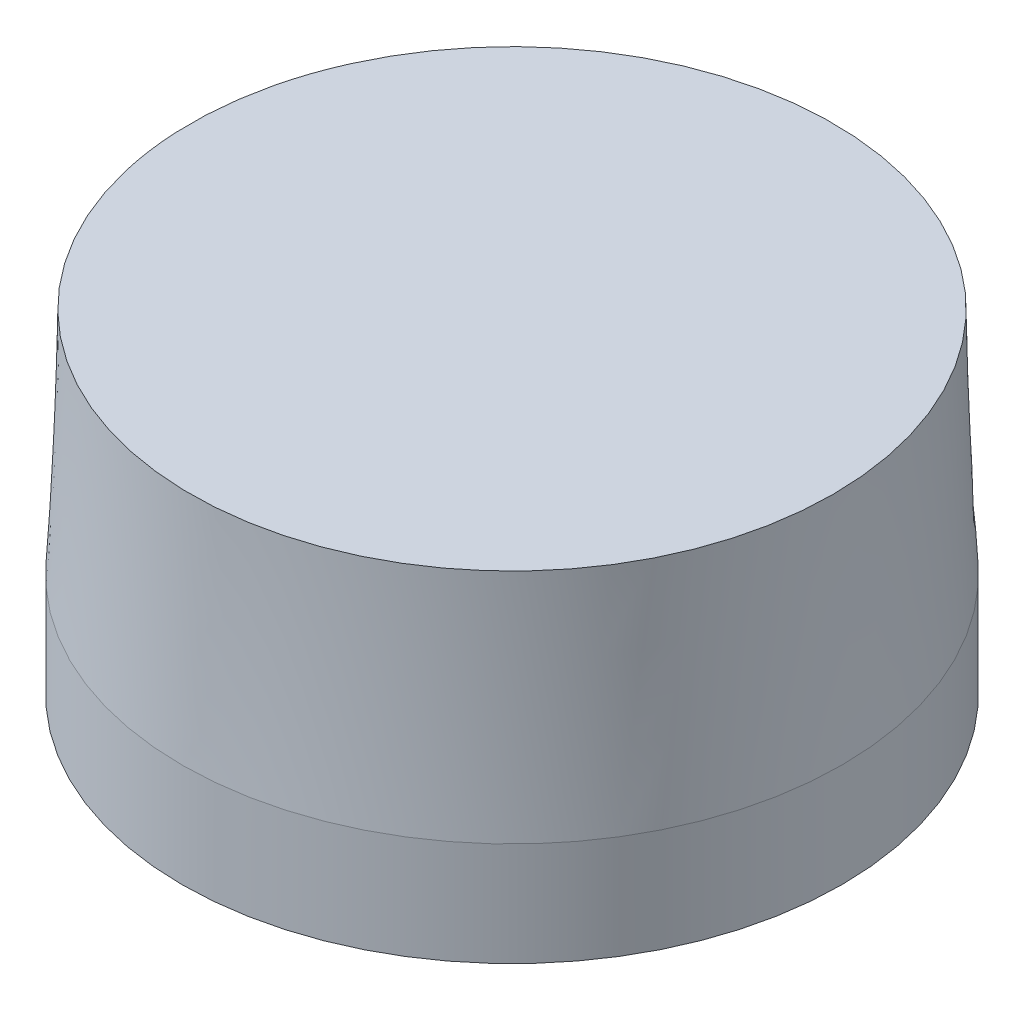
ISO-10303-21;
HEADER;
FILE_DESCRIPTION(('STEP AP214'),'2;1');
FILE_NAME('part.step','',(''),(''),'','','');
FILE_SCHEMA(('AUTOMOTIVE_DESIGN { 1 0 10303 214 1 1 1 1 }'));
ENDSEC;
DATA;
#1=APPLICATION_CONTEXT('core data for automotive mechanical design processes');
#2=APPLICATION_PROTOCOL_DEFINITION('international standard','automotive_design',2000,#1);
#3=PRODUCT_CONTEXT('',#1,'mechanical');
#4=PRODUCT('Part','Part','',(#3));
#5=PRODUCT_RELATED_PRODUCT_CATEGORY('part','',(#4));
#6=PRODUCT_DEFINITION_FORMATION('','',#4);
#7=PRODUCT_DEFINITION_CONTEXT('part definition',#1,'design');
#8=PRODUCT_DEFINITION('design','',#6,#7);
#9=PRODUCT_DEFINITION_SHAPE('','',#8);
#10=(LENGTH_UNIT() NAMED_UNIT(*) SI_UNIT(.MILLI.,.METRE.));
#11=(NAMED_UNIT(*) PLANE_ANGLE_UNIT() SI_UNIT($,.RADIAN.));
#12=(NAMED_UNIT(*) SI_UNIT($,.STERADIAN.) SOLID_ANGLE_UNIT());
#13=UNCERTAINTY_MEASURE_WITH_UNIT(LENGTH_MEASURE(1.E-05),#10,'distance_accuracy_value','');
#14=(GEOMETRIC_REPRESENTATION_CONTEXT(3) GLOBAL_UNCERTAINTY_ASSIGNED_CONTEXT((#13)) GLOBAL_UNIT_ASSIGNED_CONTEXT((#10,
#11,#12)) REPRESENTATION_CONTEXT('',''));
#15=CARTESIAN_POINT('',(0.,0.,0.));
#16=DIRECTION('',(0.,0.,1.));
#17=DIRECTION('',(1.,0.,0.));
#18=AXIS2_PLACEMENT_3D('',#15,#16,#17);
#19=CARTESIAN_POINT('',(19.65,2.25,-9.14157778240864));
#20=DIRECTION('',(0.,0.,1.));
#21=DIRECTION('',(1.,0.,0.));
#22=AXIS2_PLACEMENT_3D('',#19,#20,#21);
#23=PLANE('',#22);
#24=DIRECTION('',(-1.,0.,0.));
#25=VECTOR('',#24,1.);
#26=CARTESIAN_POINT('',(20.9,12.1830742590573,-9.14157778240864));
#27=LINE('',#26,#25);
#28=CARTESIAN_POINT('',(19.65,12.1830742590573,-9.14157778240864));
#29=VERTEX_POINT('',#28);
#30=CARTESIAN_POINT('',(18.9,12.1830742590573,-9.14157778240864));
#31=VERTEX_POINT('',#30);
#32=EDGE_CURVE('E150',#29,#31,#27,.T.);
#33=ORIENTED_EDGE('',*,*,#32,.T.);
#34=DIRECTION('',(0.,1.,0.));
#35=VECTOR('',#34,1.);
#36=CARTESIAN_POINT('',(18.9,2.25,-9.14157778240864));
#37=LINE('',#36,#35);
#38=CARTESIAN_POINT('',(18.9,2.25,-9.14157778240864));
#39=VERTEX_POINT('',#38);
#40=EDGE_CURVE('E183',#39,#31,#37,.T.);
#41=ORIENTED_EDGE('',*,*,#40,.F.);
#42=DIRECTION('',(1.,0.,0.));
#43=VECTOR('',#42,1.);
#44=CARTESIAN_POINT('',(19.65,2.25,-9.14157778240864));
#45=LINE('',#44,#43);
#46=CARTESIAN_POINT('',(19.65,2.25,-9.14157778240864));
#47=VERTEX_POINT('',#46);
#48=EDGE_CURVE('E167',#39,#47,#45,.T.);
#49=ORIENTED_EDGE('',*,*,#48,.T.);
#50=DIRECTION('',(0.,1.,0.));
#51=VECTOR('',#50,1.);
#52=CARTESIAN_POINT('',(19.65,2.25,-9.14157778240864));
#53=LINE('',#52,#51);
#54=EDGE_CURVE('E186',#47,#29,#53,.T.);
#55=ORIENTED_EDGE('',*,*,#54,.T.);
#56=EDGE_LOOP('',(#33,#41,#49,#55));
#57=FACE_BOUND('',#56,.T.);
#58=ADVANCED_FACE('F37',(#57),#23,.T.);
#59=CARTESIAN_POINT('',(0.,25.,0.));
#60=DIRECTION('',(0.,-1.,0.));
#61=DIRECTION('',(0.,0.,-1.));
#62=AXIS2_PLACEMENT_3D('',#59,#60,#61);
#63=CYLINDRICAL_SURFACE('',#62,26.9);
#64=DIRECTION('',(0.,1.,0.));
#65=VECTOR('',#64,1.);
#66=CARTESIAN_POINT('',(19.65,2.25,-18.370832860815));
#67=LINE('',#66,#65);
#68=CARTESIAN_POINT('',(19.65,2.25,-18.370832860815));
#69=VERTEX_POINT('',#68);
#70=CARTESIAN_POINT('',(19.65,24.25,-18.370832860815));
#71=VERTEX_POINT('',#70);
#72=EDGE_CURVE('E60',#69,#71,#67,.T.);
#73=ORIENTED_EDGE('',*,*,#72,.F.);
#74=CARTESIAN_POINT('',(0.,2.25,0.));
#75=DIRECTION('',(0.,1.,0.));
#76=DIRECTION('',(0.,0.,1.));
#77=AXIS2_PLACEMENT_3D('',#74,#75,#76);
#78=CIRCLE('',#77,26.9);
#79=CARTESIAN_POINT('',(18.9,2.25,-19.1415777824086));
#80=VERTEX_POINT('',#79);
#81=EDGE_CURVE('E161',#69,#80,#78,.T.);
#82=ORIENTED_EDGE('',*,*,#81,.T.);
#83=DIRECTION('',(0.,1.,0.));
#84=VECTOR('',#83,1.);
#85=CARTESIAN_POINT('',(18.9,2.25,-19.1415777824086));
#86=LINE('',#85,#84);
#87=CARTESIAN_POINT('',(18.9,24.25,-19.1415777824086));
#88=VERTEX_POINT('',#87);
#89=EDGE_CURVE('E173',#80,#88,#86,.T.);
#90=ORIENTED_EDGE('',*,*,#89,.T.);
#91=CARTESIAN_POINT('',(0.,24.25,0.));
#92=DIRECTION('',(0.,-1.,0.));
#93=DIRECTION('',(0.,0.,-1.));
#94=AXIS2_PLACEMENT_3D('',#91,#92,#93);
#95=CIRCLE('',#94,26.9);
#96=CARTESIAN_POINT('',(18.9,24.25,19.1415777824086));
#97=VERTEX_POINT('',#96);
#98=EDGE_CURVE('E218',#97,#88,#95,.T.);
#99=ORIENTED_EDGE('',*,*,#98,.F.);
#100=DIRECTION('',(0.,1.,0.));
#101=VECTOR('',#100,1.);
#102=CARTESIAN_POINT('',(18.9,2.25,19.1415777824086));
#103=LINE('',#102,#101);
#104=CARTESIAN_POINT('',(18.9,2.25,19.1415777824086));
#105=VERTEX_POINT('',#104);
#106=EDGE_CURVE('E215',#105,#97,#103,.T.);
#107=ORIENTED_EDGE('',*,*,#106,.F.);
#108=CARTESIAN_POINT('',(0.,2.25,0.));
#109=DIRECTION('',(0.,-1.,0.));
#110=DIRECTION('',(0.,0.,-1.));
#111=AXIS2_PLACEMENT_3D('',#108,#109,#110);
#112=CIRCLE('',#111,26.9);
#113=CARTESIAN_POINT('',(19.65,2.25,18.370832860815));
#114=VERTEX_POINT('',#113);
#115=EDGE_CURVE('E191',#114,#105,#112,.T.);
#116=ORIENTED_EDGE('',*,*,#115,.F.);
#117=DIRECTION('',(0.,1.,0.));
#118=VECTOR('',#117,1.);
#119=CARTESIAN_POINT('',(19.65,2.25,18.370832860815));
#120=LINE('',#119,#118);
#121=CARTESIAN_POINT('',(19.65,24.25,18.370832860815));
#122=VERTEX_POINT('',#121);
#123=EDGE_CURVE('E201',#114,#122,#120,.T.);
#124=ORIENTED_EDGE('',*,*,#123,.T.);
#125=EDGE_CURVE('E217',#71,#122,#95,.T.);
#126=ORIENTED_EDGE('',*,*,#125,.F.);
#127=EDGE_LOOP('',(#73,#82,#90,#99,#107,#116,#124,#126));
#128=FACE_BOUND('',#127,.T.);
#129=CARTESIAN_POINT('',(0.,0.,0.));
#130=DIRECTION('',(0.,1.,0.));
#131=DIRECTION('',(0.,0.,1.));
#132=AXIS2_PLACEMENT_3D('',#129,#130,#131);
#133=CIRCLE('',#132,26.9);
#134=CARTESIAN_POINT('',(0.,0.,26.9));
#135=VERTEX_POINT('',#134);
#136=EDGE_CURVE('E45',#135,#135,#133,.T.);
#137=ORIENTED_EDGE('',*,*,#136,.F.);
#138=EDGE_LOOP('',(#137));
#139=FACE_BOUND('',#138,.T.);
#140=ADVANCED_FACE('F39',(#128,#139),#63,.F.);
#141=CARTESIAN_POINT('',(0.,24.25,0.));
#142=DIRECTION('',(0.,-1.,0.));
#143=DIRECTION('',(0.,0.,-1.));
#144=AXIS2_PLACEMENT_3D('',#141,#142,#143);
#145=PLANE('',#144);
#146=DIRECTION('',(0.,0.,-1.));
#147=VECTOR('',#146,1.);
#148=CARTESIAN_POINT('',(19.65,24.25,-18.370832860815));
#149=LINE('',#148,#147);
#150=CARTESIAN_POINT('',(19.65,24.25,-9.14157778240864));
#151=VERTEX_POINT('',#150);
#152=EDGE_CURVE('E160',#151,#71,#149,.T.);
#153=ORIENTED_EDGE('',*,*,#152,.T.);
#154=ORIENTED_EDGE('',*,*,#125,.T.);
#155=DIRECTION('',(0.,0.,1.));
#156=VECTOR('',#155,1.);
#157=CARTESIAN_POINT('',(19.65,24.25,18.370832860815));
#158=LINE('',#157,#156);
#159=CARTESIAN_POINT('',(19.65,24.25,9.14157778240864));
#160=VERTEX_POINT('',#159);
#161=EDGE_CURVE('E195',#160,#122,#158,.T.);
#162=ORIENTED_EDGE('',*,*,#161,.F.);
#163=DIRECTION('',(1.,0.,0.));
#164=VECTOR('',#163,1.);
#165=CARTESIAN_POINT('',(19.65,24.25,9.14157778240864));
#166=LINE('',#165,#164);
#167=CARTESIAN_POINT('',(18.9,24.25,9.14157778240864));
#168=VERTEX_POINT('',#167);
#169=EDGE_CURVE('E203',#168,#160,#166,.T.);
#170=ORIENTED_EDGE('',*,*,#169,.F.);
#171=DIRECTION('',(0.,0.,-1.));
#172=VECTOR('',#171,1.);
#173=CARTESIAN_POINT('',(18.9,24.25,9.14157778240864));
#174=LINE('',#173,#172);
#175=EDGE_CURVE('E190',#97,#168,#174,.T.);
#176=ORIENTED_EDGE('',*,*,#175,.F.);
#177=ORIENTED_EDGE('',*,*,#98,.T.);
#178=DIRECTION('',(0.,0.,1.));
#179=VECTOR('',#178,1.);
#180=CARTESIAN_POINT('',(18.9,24.25,-9.14157778240864));
#181=LINE('',#180,#179);
#182=CARTESIAN_POINT('',(18.9,24.25,-9.14157778240864));
#183=VERTEX_POINT('',#182);
#184=EDGE_CURVE('E164',#88,#183,#181,.T.);
#185=ORIENTED_EDGE('',*,*,#184,.T.);
#186=DIRECTION('',(1.,0.,0.));
#187=VECTOR('',#186,1.);
#188=CARTESIAN_POINT('',(19.65,24.25,-9.14157778240864));
#189=LINE('',#188,#187);
#190=EDGE_CURVE('E175',#183,#151,#189,.T.);
#191=ORIENTED_EDGE('',*,*,#190,.T.);
#192=EDGE_LOOP('',(#153,#154,#162,#170,#176,#177,#185,#191));
#193=FACE_BOUND('',#192,.T.);
#194=ADVANCED_FACE('F238',(#193),#145,.T.);
#195=CARTESIAN_POINT('',(0.,0.,0.));
#196=DIRECTION('',(0.,1.,0.));
#197=DIRECTION('',(0.,0.,1.));
#198=AXIS2_PLACEMENT_3D('',#195,#196,#197);
#199=PLANE('',#198);
#200=ORIENTED_EDGE('',*,*,#136,.T.);
#201=EDGE_LOOP('',(#200));
#202=FACE_BOUND('',#201,.T.);
#203=CARTESIAN_POINT('',(0.,0.,0.));
#204=DIRECTION('',(0.,1.,0.));
#205=DIRECTION('',(0.,0.,1.));
#206=AXIS2_PLACEMENT_3D('',#203,#204,#205);
#207=CIRCLE('',#206,27.9);
#208=CARTESIAN_POINT('',(0.,0.,27.9));
#209=VERTEX_POINT('',#208);
#210=EDGE_CURVE('E12',#209,#209,#207,.T.);
#211=ORIENTED_EDGE('',*,*,#210,.F.);
#212=EDGE_LOOP('',(#211));
#213=FACE_BOUND('',#212,.T.);
#214=ADVANCED_FACE('F234',(#202,#213),#199,.F.);
#215=CARTESIAN_POINT('',(0.,5.,0.));
#216=DIRECTION('',(0.,-1.,0.));
#217=DIRECTION('',(0.,0.,-1.));
#218=AXIS2_PLACEMENT_3D('',#215,#216,#217);
#219=CYLINDRICAL_SURFACE('',#218,28.65);
#220=CARTESIAN_POINT('',(0.,5.,0.));
#221=DIRECTION('',(0.,1.,0.));
#222=DIRECTION('',(0.,0.,1.));
#223=AXIS2_PLACEMENT_3D('',#220,#221,#222);
#224=CIRCLE('',#223,28.65);
#225=CARTESIAN_POINT('',(27.571898019697,5.,7.78543123991395));
#226=VERTEX_POINT('',#225);
#227=EDGE_CURVE('E229',#226,#226,#224,.T.);
#228=ORIENTED_EDGE('',*,*,#227,.F.);
#229=EDGE_LOOP('',(#228));
#230=FACE_BOUND('',#229,.T.);
#231=CARTESIAN_POINT('',(0.,-4.,0.));
#232=DIRECTION('',(0.,1.,0.));
#233=DIRECTION('',(0.,0.,1.));
#234=AXIS2_PLACEMENT_3D('',#231,#232,#233);
#235=CIRCLE('',#234,28.65);
#236=CARTESIAN_POINT('',(0.,-4.,28.65));
#237=VERTEX_POINT('',#236);
#238=EDGE_CURVE('E226',#237,#237,#235,.T.);
#239=ORIENTED_EDGE('',*,*,#238,.T.);
#240=EDGE_LOOP('',(#239));
#241=FACE_BOUND('',#240,.T.);
#242=ADVANCED_FACE('F425',(#230,#241),#219,.T.);
#243=CARTESIAN_POINT('',(0.,-4.,0.));
#244=DIRECTION('',(0.,1.,0.));
#245=DIRECTION('',(0.,0.,1.));
#246=AXIS2_PLACEMENT_3D('',#243,#244,#245);
#247=CYLINDRICAL_SURFACE('',#246,27.9);
#248=CARTESIAN_POINT('',(0.,-4.,0.));
#249=DIRECTION('',(0.,1.,0.));
#250=DIRECTION('',(0.,0.,1.));
#251=AXIS2_PLACEMENT_3D('',#248,#249,#250);
#252=CIRCLE('',#251,27.9);
#253=CARTESIAN_POINT('',(0.,-4.,27.9));
#254=VERTEX_POINT('',#253);
#255=EDGE_CURVE('E223',#254,#254,#252,.T.);
#256=ORIENTED_EDGE('',*,*,#255,.F.);
#257=EDGE_LOOP('',(#256));
#258=FACE_BOUND('',#257,.T.);
#259=ORIENTED_EDGE('',*,*,#210,.T.);
#260=EDGE_LOOP('',(#259));
#261=FACE_BOUND('',#260,.T.);
#262=ADVANCED_FACE('F414',(#258,#261),#247,.F.);
#263=CARTESIAN_POINT('',(0.,-4.,0.));
#264=DIRECTION('',(0.,1.,0.));
#265=DIRECTION('',(0.,0.,1.));
#266=AXIS2_PLACEMENT_3D('',#263,#264,#265);
#267=PLANE('',#266);
#268=ORIENTED_EDGE('',*,*,#255,.T.);
#269=EDGE_LOOP('',(#268));
#270=FACE_BOUND('',#269,.T.);
#271=ORIENTED_EDGE('',*,*,#238,.F.);
#272=EDGE_LOOP('',(#271));
#273=FACE_BOUND('',#272,.T.);
#274=ADVANCED_FACE('F403',(#270,#273),#267,.F.);
#275=CARTESIAN_POINT('',(27.7794563342098,25.,2.59071530194459));
#276=CARTESIAN_POINT('',(27.571898019697,5.,7.78543123991395));
#277=CARTESIAN_POINT('',(22.5980257303206,25.,58.1496279703642));
#278=CARTESIAN_POINT('',(12.0010355398691,5.,62.929227279308));
#279=CARTESIAN_POINT('',(-32.960886938099,25.,52.968197366475));
#280=CARTESIAN_POINT('',(-43.1427604995249,5.,47.3583647994801));
#281=CARTESIAN_POINT('',(-27.7794563342098,25.,-2.59071530194459));
#282=CARTESIAN_POINT('',(-27.571898019697,5.,-7.78543123991395));
#283=CARTESIAN_POINT('',(-22.5980257303206,25.,-58.1496279703642));
#284=CARTESIAN_POINT('',(-12.0010355398691,5.,-62.9292272793079));
#285=CARTESIAN_POINT('',(32.960886938099,25.,-52.9681973664751));
#286=CARTESIAN_POINT('',(43.1427604995249,5.,-47.35836479948));
#287=CARTESIAN_POINT('',(27.7794563342098,25.,2.59071530194459));
#288=CARTESIAN_POINT('',(27.571898019697,5.,7.78543123991395));
#289=(BOUNDED_SURFACE() B_SPLINE_SURFACE(3,1,((#275,#276),(#277,#278),(#279,#280),(#281,#282),
(#283,#284),(#285,#286),(#287,#288)),.UNSPECIFIED.,.T.,.F.,.F.) B_SPLINE_SURFACE_WITH_KNOTS((4,
3,4),(2,2),(0.,0.5,1.),(0.,1.),
.UNSPECIFIED.) GEOMETRIC_REPRESENTATION_ITEM() RATIONAL_B_SPLINE_SURFACE(((1.,1.),
(0.333333333333333,0.333333333333333),(0.333333333333333,0.333333333333333),(1.,1.),
(0.333333333333333,0.333333333333334),(0.333333333333333,0.333333333333334),(1.,1.))) REPRESENTATION_ITEM('') SURFACE());
#290=CARTESIAN_POINT('',(0.,25.,0.));
#291=DIRECTION('',(0.,1.,0.));
#292=DIRECTION('',(0.,0.,1.));
#293=AXIS2_PLACEMENT_3D('',#290,#291,#292);
#294=CIRCLE('',#293,27.9);
#295=CARTESIAN_POINT('',(27.7794563342098,25.,2.59071530194459));
#296=VERTEX_POINT('',#295);
#297=EDGE_CURVE('E220',#296,#296,#294,.T.);
#298=CARTESIAN_POINT('',(27.7794563342098,25.,2.59071530194459));
#299=CARTESIAN_POINT('',(27.7772942684336,24.7916666666667,2.64482692629843));
#300=CARTESIAN_POINT('',(27.7751322026575,24.5833333333333,2.69893855065228));
#301=CARTESIAN_POINT('',(27.7708080711051,24.1666666666667,2.80716179935998));
#302=CARTESIAN_POINT('',(27.7686460053289,23.9583333333333,2.86127342371382));
#303=CARTESIAN_POINT('',(27.7643218737766,23.5416666666667,2.96949667242152));
#304=CARTESIAN_POINT('',(27.7621598080004,23.3333333333333,3.02360829677537));
#305=CARTESIAN_POINT('',(27.7578356764481,22.9166666666667,3.13183154548306));
#306=CARTESIAN_POINT('',(27.7556736106719,22.7083333333333,3.18594316983691));
#307=CARTESIAN_POINT('',(27.7513494791195,22.2916666666667,3.2941664185446));
#308=CARTESIAN_POINT('',(27.7491874133434,22.0833333333333,3.34827804289845));
#309=CARTESIAN_POINT('',(27.744863281791,21.6666666666667,3.45650129160615));
#310=CARTESIAN_POINT('',(27.7427012160148,21.4583333333333,3.51061291595999));
#311=CARTESIAN_POINT('',(27.7383770844625,21.0416666666667,3.61883616466769));
#312=CARTESIAN_POINT('',(27.7362150186863,20.8333333333333,3.67294778902154));
#313=CARTESIAN_POINT('',(27.731890887134,20.4166666666667,3.78117103772923));
#314=CARTESIAN_POINT('',(27.7297288213578,20.2083333333333,3.83528266208308));
#315=CARTESIAN_POINT('',(27.7254046898054,19.7916666666667,3.94350591079078));
#316=CARTESIAN_POINT('',(27.7232426240293,19.5833333333333,3.99761753514462));
#317=CARTESIAN_POINT('',(27.7189184924769,19.1666666666667,4.10584078385232));
#318=CARTESIAN_POINT('',(27.7167564267007,18.9583333333333,4.15995240820616));
#319=CARTESIAN_POINT('',(27.7124322951484,18.5416666666667,4.26817565691386));
#320=CARTESIAN_POINT('',(27.7102702293722,18.3333333333333,4.32228728126771));
#321=CARTESIAN_POINT('',(27.7059460978199,17.9166666666667,4.4305105299754));
#322=CARTESIAN_POINT('',(27.7037840320437,17.7083333333333,4.48462215432925));
#323=CARTESIAN_POINT('',(27.6994599004913,17.2916666666667,4.59284540303694));
#324=CARTESIAN_POINT('',(27.6972978347152,17.0833333333333,4.64695702739079));
#325=CARTESIAN_POINT('',(27.6929737031628,16.6666666666667,4.75518027609849));
#326=CARTESIAN_POINT('',(27.6908116373866,16.4583333333333,4.80929190045234));
#327=CARTESIAN_POINT('',(27.6864875058343,16.0416666666667,4.91751514916003));
#328=CARTESIAN_POINT('',(27.6843254400581,15.8333333333333,4.97162677351388));
#329=CARTESIAN_POINT('',(27.6800013085058,15.4166666666667,5.07985002222157));
#330=CARTESIAN_POINT('',(27.6778392427296,15.2083333333333,5.13396164657542));
#331=CARTESIAN_POINT('',(27.6735151111772,14.7916666666667,5.24218489528312));
#332=CARTESIAN_POINT('',(27.6713530454011,14.5833333333333,5.29629651963696));
#333=CARTESIAN_POINT('',(27.6670289138487,14.1666666666667,5.40451976834466));
#334=CARTESIAN_POINT('',(27.6648668480725,13.9583333333333,5.45863139269851));
#335=CARTESIAN_POINT('',(27.6605427165202,13.5416666666667,5.5668546414062));
#336=CARTESIAN_POINT('',(27.658380650744,13.3333333333333,5.62096626576005));
#337=CARTESIAN_POINT('',(27.6540565191917,12.9166666666667,5.72918951446774));
#338=CARTESIAN_POINT('',(27.6518944534155,12.7083333333333,5.78330113882159));
#339=CARTESIAN_POINT('',(27.6475703218631,12.2916666666667,5.89152438752929));
#340=CARTESIAN_POINT('',(27.645408256087,12.0833333333333,5.94563601188313));
#341=CARTESIAN_POINT('',(27.6410841245346,11.6666666666667,6.05385926059083));
#342=CARTESIAN_POINT('',(27.6389220587584,11.4583333333333,6.10797088494468));
#343=CARTESIAN_POINT('',(27.6345979272061,11.0416666666667,6.21619413365237));
#344=CARTESIAN_POINT('',(27.6324358614299,10.8333333333333,6.27030575800622));
#345=CARTESIAN_POINT('',(27.6281117298776,10.4166666666667,6.37852900671392));
#346=CARTESIAN_POINT('',(27.6259496641014,10.2083333333333,6.43264063106776));
#347=CARTESIAN_POINT('',(27.621625532549,9.79166666666667,6.54086387977546));
#348=CARTESIAN_POINT('',(27.6194634667729,9.58333333333333,6.5949755041293));
#349=CARTESIAN_POINT('',(27.6151393352205,9.16666666666667,6.703198752837));
#350=CARTESIAN_POINT('',(27.6129772694443,8.95833333333333,6.75731037719085));
#351=CARTESIAN_POINT('',(27.608653137892,8.54166666666667,6.86553362589854));
#352=CARTESIAN_POINT('',(27.6064910721158,8.33333333333333,6.91964525025239));
#353=CARTESIAN_POINT('',(27.6021669405635,7.91666666666667,7.02786849896008));
#354=CARTESIAN_POINT('',(27.6000048747873,7.70833333333333,7.08198012331393));
#355=CARTESIAN_POINT('',(27.5956807432349,7.29166666666667,7.19020337202163));
#356=CARTESIAN_POINT('',(27.5935186774588,7.08333333333333,7.24431499637547));
#357=CARTESIAN_POINT('',(27.5891945459064,6.66666666666667,7.35253824508317));
#358=CARTESIAN_POINT('',(27.5870324801302,6.45833333333333,7.40664986943702));
#359=CARTESIAN_POINT('',(27.5827083485779,6.04166666666667,7.51487311814471));
#360=CARTESIAN_POINT('',(27.5805462828017,5.83333333333333,7.56898474249856));
#361=CARTESIAN_POINT('',(27.5762221512494,5.41666666666667,7.67720799120625));
#362=CARTESIAN_POINT('',(27.5740600854732,5.20833333333333,7.7313196155601));
#363=CARTESIAN_POINT('',(27.571898019697,5.,7.78543123991395));
#364=B_SPLINE_CURVE_WITH_KNOTS('',3,(#298,#299,#300,#301,#302,#303,#304,#305,#306,#307,#308,
#309,#310,#311,#312,#313,#314,#315,#316,#317,#318,#319,#320,#321,#322,#323,#324,#325,#326,#327,
#328,#329,#330,#331,#332,#333,#334,#335,#336,#337,#338,#339,#340,#341,#342,#343,#344,#345,#346,
#347,#348,#349,#350,#351,#352,#353,#354,#355,#356,#357,#358,#359,#360,#361,#362,#363),
.UNSPECIFIED.,.F.,.F.,(4,2,2,2,2,2,2,2,2,2,2,2,2,2,2,2,2,2,2,2,2,2,2,2,2,2,2,2,2,2,2,2,4),(0.,
0.645770610795887,1.29154122159177,1.93731183238766,2.58308244318354,3.22885305397943,
3.87462366477532,4.5203942755712,5.16616488636709,5.81193549716297,6.45770610795886,
7.10347671875475,7.74924732955063,8.39501794034652,9.04078855114241,9.68655916193829,
10.3323297727342,10.9781003835301,11.6238709943259,12.2696416051218,12.9154122159177,
13.5611828267136,14.2069534375095,14.8527240483054,15.4984946591013,16.1442652698972,
16.790035880693,17.4358064914889,18.0815771022848,18.7273477130807,19.3731183238766,
20.0188889346725,20.6646595454684),.UNSPECIFIED.);
#365=EDGE_CURVE('BSEAM392',#296,#226,#364,.T.);
#366=ORIENTED_EDGE('',*,*,#297,.F.);
#367=ORIENTED_EDGE('',*,*,#227,.T.);
#368=ORIENTED_EDGE('',*,*,#365,.T.);
#369=ORIENTED_EDGE('',*,*,#365,.F.);
#370=EDGE_LOOP('',(#366,#368,#367,#369));
#371=FACE_BOUND('',#370,.T.);
#372=ADVANCED_FACE('F392',(#371),#289,.T.);
#373=CARTESIAN_POINT('',(0.,25.,0.));
#374=DIRECTION('',(0.,1.,0.));
#375=DIRECTION('',(0.,0.,1.));
#376=AXIS2_PLACEMENT_3D('',#373,#374,#375);
#377=PLANE('',#376);
#378=ORIENTED_EDGE('',*,*,#297,.T.);
#379=EDGE_LOOP('',(#378));
#380=FACE_BOUND('',#379,.T.);
#381=ADVANCED_FACE('F384',(#380),#377,.T.);
#382=CARTESIAN_POINT('',(18.9,2.25,9.14157778240864));
#383=DIRECTION('',(1.,0.,0.));
#384=DIRECTION('',(0.,0.,-1.));
#385=AXIS2_PLACEMENT_3D('',#382,#383,#384);
#386=PLANE('',#385);
#387=ORIENTED_EDGE('',*,*,#175,.T.);
#388=DIRECTION('',(0.,1.,0.));
#389=VECTOR('',#388,1.);
#390=CARTESIAN_POINT('',(18.9,2.25,9.14157778240864));
#391=LINE('',#390,#389);
#392=CARTESIAN_POINT('',(18.9,2.25,9.14157778240864));
#393=VERTEX_POINT('',#392);
#394=EDGE_CURVE('E212',#393,#168,#391,.T.);
#395=ORIENTED_EDGE('',*,*,#394,.F.);
#396=DIRECTION('',(0.,0.,-1.));
#397=VECTOR('',#396,1.);
#398=CARTESIAN_POINT('',(18.9,2.25,9.14157778240864));
#399=LINE('',#398,#397);
#400=EDGE_CURVE('E194',#105,#393,#399,.T.);
#401=ORIENTED_EDGE('',*,*,#400,.F.);
#402=ORIENTED_EDGE('',*,*,#106,.T.);
#403=EDGE_LOOP('',(#387,#395,#401,#402));
#404=FACE_BOUND('',#403,.T.);
#405=ADVANCED_FACE('F282',(#404),#386,.F.);
#406=CARTESIAN_POINT('',(19.65,2.25,9.14157778240864));
#407=DIRECTION('',(0.,0.,1.));
#408=DIRECTION('',(1.,0.,0.));
#409=AXIS2_PLACEMENT_3D('',#406,#407,#408);
#410=PLANE('',#409);
#411=ORIENTED_EDGE('',*,*,#169,.T.);
#412=DIRECTION('',(0.,1.,0.));
#413=VECTOR('',#412,1.);
#414=CARTESIAN_POINT('',(19.65,2.25,9.14157778240864));
#415=LINE('',#414,#413);
#416=CARTESIAN_POINT('',(19.65,2.25,9.14157778240864));
#417=VERTEX_POINT('',#416);
#418=EDGE_CURVE('E210',#417,#160,#415,.T.);
#419=ORIENTED_EDGE('',*,*,#418,.F.);
#420=DIRECTION('',(1.,0.,0.));
#421=VECTOR('',#420,1.);
#422=CARTESIAN_POINT('',(19.65,2.25,9.14157778240864));
#423=LINE('',#422,#421);
#424=EDGE_CURVE('E197',#393,#417,#423,.T.);
#425=ORIENTED_EDGE('',*,*,#424,.F.);
#426=ORIENTED_EDGE('',*,*,#394,.T.);
#427=EDGE_LOOP('',(#411,#419,#425,#426));
#428=FACE_BOUND('',#427,.T.);
#429=ADVANCED_FACE('F278',(#428),#410,.F.);
#430=CARTESIAN_POINT('',(19.65,2.25,18.370832860815));
#431=DIRECTION('',(-1.,0.,0.));
#432=DIRECTION('',(0.,0.,1.));
#433=AXIS2_PLACEMENT_3D('',#430,#431,#432);
#434=PLANE('',#433);
#435=ORIENTED_EDGE('',*,*,#161,.T.);
#436=ORIENTED_EDGE('',*,*,#123,.F.);
#437=DIRECTION('',(0.,0.,1.));
#438=VECTOR('',#437,1.);
#439=CARTESIAN_POINT('',(19.65,2.25,18.370832860815));
#440=LINE('',#439,#438);
#441=EDGE_CURVE('E199',#417,#114,#440,.T.);
#442=ORIENTED_EDGE('',*,*,#441,.F.);
#443=ORIENTED_EDGE('',*,*,#418,.T.);
#444=EDGE_LOOP('',(#435,#436,#442,#443));
#445=FACE_BOUND('',#444,.T.);
#446=ADVANCED_FACE('F272',(#445),#434,.F.);
#447=CARTESIAN_POINT('',(0.,2.25,0.));
#448=DIRECTION('',(0.,-1.,0.));
#449=DIRECTION('',(0.,0.,-1.));
#450=AXIS2_PLACEMENT_3D('',#447,#448,#449);
#451=PLANE('',#450);
#452=ORIENTED_EDGE('',*,*,#115,.T.);
#453=ORIENTED_EDGE('',*,*,#400,.T.);
#454=ORIENTED_EDGE('',*,*,#424,.T.);
#455=ORIENTED_EDGE('',*,*,#441,.T.);
#456=EDGE_LOOP('',(#452,#453,#454,#455));
#457=FACE_BOUND('',#456,.T.);
#458=ADVANCED_FACE('F260',(#457),#451,.T.);
#459=CARTESIAN_POINT('',(19.65,2.25,-18.370832860815));
#460=DIRECTION('',(1.,0.,0.));
#461=DIRECTION('',(0.,0.,-1.));
#462=AXIS2_PLACEMENT_3D('',#459,#460,#461);
#463=PLANE('',#462);
#464=DIRECTION('',(0.,0.,-1.));
#465=VECTOR('',#464,1.);
#466=CARTESIAN_POINT('',(19.65,12.1830742590573,-18.370832860815));
#467=LINE('',#466,#465);
#468=CARTESIAN_POINT('',(19.65,12.1830742590573,-11.6415777824086));
#469=VERTEX_POINT('',#468);
#470=EDGE_CURVE('E158',#29,#469,#467,.T.);
#471=ORIENTED_EDGE('',*,*,#470,.F.);
#472=ORIENTED_EDGE('',*,*,#54,.F.);
#473=DIRECTION('',(0.,0.,-1.));
#474=VECTOR('',#473,1.);
#475=CARTESIAN_POINT('',(19.65,2.25,-18.370832860815));
#476=LINE('',#475,#474);
#477=EDGE_CURVE('E163',#47,#69,#476,.T.);
#478=ORIENTED_EDGE('',*,*,#477,.T.);
#479=ORIENTED_EDGE('',*,*,#72,.T.);
#480=ORIENTED_EDGE('',*,*,#152,.F.);
#481=CARTESIAN_POINT('',(19.65,15.6830742590573,-9.14157778240864));
#482=VERTEX_POINT('',#481);
#483=EDGE_CURVE('E185',#482,#151,#53,.T.);
#484=ORIENTED_EDGE('',*,*,#483,.F.);
#485=DIRECTION('',(0.,0.,1.));
#486=VECTOR('',#485,1.);
#487=CARTESIAN_POINT('',(19.65,15.6830742590573,-18.370832860815));
#488=LINE('',#487,#486);
#489=CARTESIAN_POINT('',(19.65,15.6830742590573,-11.6415777824086));
#490=VERTEX_POINT('',#489);
#491=EDGE_CURVE('E153',#490,#482,#488,.T.);
#492=ORIENTED_EDGE('',*,*,#491,.F.);
#493=CARTESIAN_POINT('',(19.65,13.9330742590573,-11.6415777824086));
#494=DIRECTION('',(1.,0.,0.));
#495=DIRECTION('',(0.,0.,-1.));
#496=AXIS2_PLACEMENT_3D('',#493,#494,#495);
#497=CIRCLE('',#496,1.75);
#498=EDGE_CURVE('E135',#469,#490,#497,.T.);
#499=ORIENTED_EDGE('',*,*,#498,.F.);
#500=EDGE_LOOP('',(#471,#472,#478,#479,#480,#484,#492,#499));
#501=FACE_BOUND('',#500,.T.);
#502=ADVANCED_FACE('F253',(#501),#463,.T.);
#503=DIRECTION('',(-1.,0.,0.));
#504=VECTOR('',#503,1.);
#505=CARTESIAN_POINT('',(20.9,15.6830742590573,-9.14157778240864));
#506=LINE('',#505,#504);
#507=CARTESIAN_POINT('',(18.9,15.6830742590573,-9.14157778240864));
#508=VERTEX_POINT('',#507);
#509=EDGE_CURVE('E52',#482,#508,#506,.T.);
#510=ORIENTED_EDGE('',*,*,#509,.F.);
#511=ORIENTED_EDGE('',*,*,#483,.T.);
#512=ORIENTED_EDGE('',*,*,#190,.F.);
#513=EDGE_CURVE('E182',#508,#183,#37,.T.);
#514=ORIENTED_EDGE('',*,*,#513,.F.);
#515=EDGE_LOOP('',(#510,#511,#512,#514));
#516=FACE_BOUND('',#515,.T.);
#517=ADVANCED_FACE('F247',(#516),#23,.T.);
#518=CARTESIAN_POINT('',(18.9,2.25,-9.14157778240864));
#519=DIRECTION('',(-1.,0.,0.));
#520=DIRECTION('',(0.,0.,1.));
#521=AXIS2_PLACEMENT_3D('',#518,#519,#520);
#522=PLANE('',#521);
#523=DIRECTION('',(0.,0.,1.));
#524=VECTOR('',#523,1.);
#525=CARTESIAN_POINT('',(18.9,12.1830742590573,-9.14157778240864));
#526=LINE('',#525,#524);
#527=CARTESIAN_POINT('',(18.9,12.1830742590573,-11.6415777824086));
#528=VERTEX_POINT('',#527);
#529=EDGE_CURVE('E146',#528,#31,#526,.T.);
#530=ORIENTED_EDGE('',*,*,#529,.F.);
#531=CARTESIAN_POINT('',(18.9,13.9330742590573,-11.6415777824086));
#532=DIRECTION('',(-1.,0.,0.));
#533=DIRECTION('',(0.,0.,1.));
#534=AXIS2_PLACEMENT_3D('',#531,#532,#533);
#535=CIRCLE('',#534,1.75);
#536=CARTESIAN_POINT('',(18.9,15.6830742590573,-11.6415777824086));
#537=VERTEX_POINT('',#536);
#538=EDGE_CURVE('E132',#537,#528,#535,.T.);
#539=ORIENTED_EDGE('',*,*,#538,.F.);
#540=DIRECTION('',(0.,0.,-1.));
#541=VECTOR('',#540,1.);
#542=CARTESIAN_POINT('',(18.9,15.6830742590573,-9.14157778240864));
#543=LINE('',#542,#541);
#544=EDGE_CURVE('E139',#508,#537,#543,.T.);
#545=ORIENTED_EDGE('',*,*,#544,.F.);
#546=ORIENTED_EDGE('',*,*,#513,.T.);
#547=ORIENTED_EDGE('',*,*,#184,.F.);
#548=ORIENTED_EDGE('',*,*,#89,.F.);
#549=DIRECTION('',(0.,0.,1.));
#550=VECTOR('',#549,1.);
#551=CARTESIAN_POINT('',(18.9,2.25,-9.14157778240864));
#552=LINE('',#551,#550);
#553=EDGE_CURVE('E170',#80,#39,#552,.T.);
#554=ORIENTED_EDGE('',*,*,#553,.T.);
#555=ORIENTED_EDGE('',*,*,#40,.T.);
#556=EDGE_LOOP('',(#530,#539,#545,#546,#547,#548,#554,#555));
#557=FACE_BOUND('',#556,.T.);
#558=ADVANCED_FACE('F144',(#557),#522,.T.);
#559=CARTESIAN_POINT('',(0.,2.25,0.));
#560=DIRECTION('',(0.,-1.,0.));
#561=DIRECTION('',(0.,0.,1.));
#562=AXIS2_PLACEMENT_3D('',#559,#560,#561);
#563=PLANE('',#562);
#564=ORIENTED_EDGE('',*,*,#81,.F.);
#565=ORIENTED_EDGE('',*,*,#477,.F.);
#566=ORIENTED_EDGE('',*,*,#48,.F.);
#567=ORIENTED_EDGE('',*,*,#553,.F.);
#568=EDGE_LOOP('',(#564,#565,#566,#567));
#569=FACE_BOUND('',#568,.T.);
#570=ADVANCED_FACE('F259',(#569),#563,.T.);
#571=CARTESIAN_POINT('',(20.9,12.1830742590573,-9.14157778240864));
#572=DIRECTION('',(0.,-1.,0.));
#573=DIRECTION('',(0.,0.,-1.));
#574=AXIS2_PLACEMENT_3D('',#571,#572,#573);
#575=PLANE('',#574);
#576=ORIENTED_EDGE('',*,*,#470,.T.);
#577=DIRECTION('',(-1.,0.,0.));
#578=VECTOR('',#577,1.);
#579=CARTESIAN_POINT('',(20.9,12.1830742590573,-11.6415777824086));
#580=LINE('',#579,#578);
#581=EDGE_CURVE('E137',#469,#528,#580,.T.);
#582=ORIENTED_EDGE('',*,*,#581,.T.);
#583=ORIENTED_EDGE('',*,*,#529,.T.);
#584=ORIENTED_EDGE('',*,*,#32,.F.);
#585=EDGE_LOOP('',(#576,#582,#583,#584));
#586=FACE_BOUND('',#585,.T.);
#587=ADVANCED_FACE('F290',(#586),#575,.F.);
#588=CARTESIAN_POINT('',(20.9,13.9330742590573,-11.6415777824086));
#589=DIRECTION('',(-1.,0.,0.));
#590=DIRECTION('',(0.,0.,1.));
#591=AXIS2_PLACEMENT_3D('',#588,#589,#590);
#592=CYLINDRICAL_SURFACE('',#591,1.75);
#593=ORIENTED_EDGE('',*,*,#498,.T.);
#594=DIRECTION('',(-1.,0.,0.));
#595=VECTOR('',#594,1.);
#596=CARTESIAN_POINT('',(20.9,15.6830742590573,-11.6415777824086));
#597=LINE('',#596,#595);
#598=EDGE_CURVE('E128',#490,#537,#597,.T.);
#599=ORIENTED_EDGE('',*,*,#598,.T.);
#600=ORIENTED_EDGE('',*,*,#538,.T.);
#601=ORIENTED_EDGE('',*,*,#581,.F.);
#602=EDGE_LOOP('',(#593,#599,#600,#601));
#603=FACE_BOUND('',#602,.T.);
#604=ADVANCED_FACE('F129',(#603),#592,.F.);
#605=CARTESIAN_POINT('',(20.9,15.6830742590573,-9.14157778240864));
#606=DIRECTION('',(0.,1.,0.));
#607=DIRECTION('',(0.,0.,1.));
#608=AXIS2_PLACEMENT_3D('',#605,#606,#607);
#609=PLANE('',#608);
#610=ORIENTED_EDGE('',*,*,#491,.T.);
#611=ORIENTED_EDGE('',*,*,#509,.T.);
#612=ORIENTED_EDGE('',*,*,#544,.T.);
#613=ORIENTED_EDGE('',*,*,#598,.F.);
#614=EDGE_LOOP('',(#610,#611,#612,#613));
#615=FACE_BOUND('',#614,.T.);
#616=ADVANCED_FACE('F140',(#615),#609,.F.);
#617=CLOSED_SHELL('',(#58,#140,#194,#214,#242,#262,#274,#372,#381,#405,#429,#446,#458,#502,#517,
#558,#570,#587,#604,#616));
#618=MANIFOLD_SOLID_BREP('B2',#617);
#619=ADVANCED_BREP_SHAPE_REPRESENTATION('',(#18,#618),#14);
#620=SHAPE_DEFINITION_REPRESENTATION(#9,#619);
ENDSEC;
END-ISO-10303-21;
